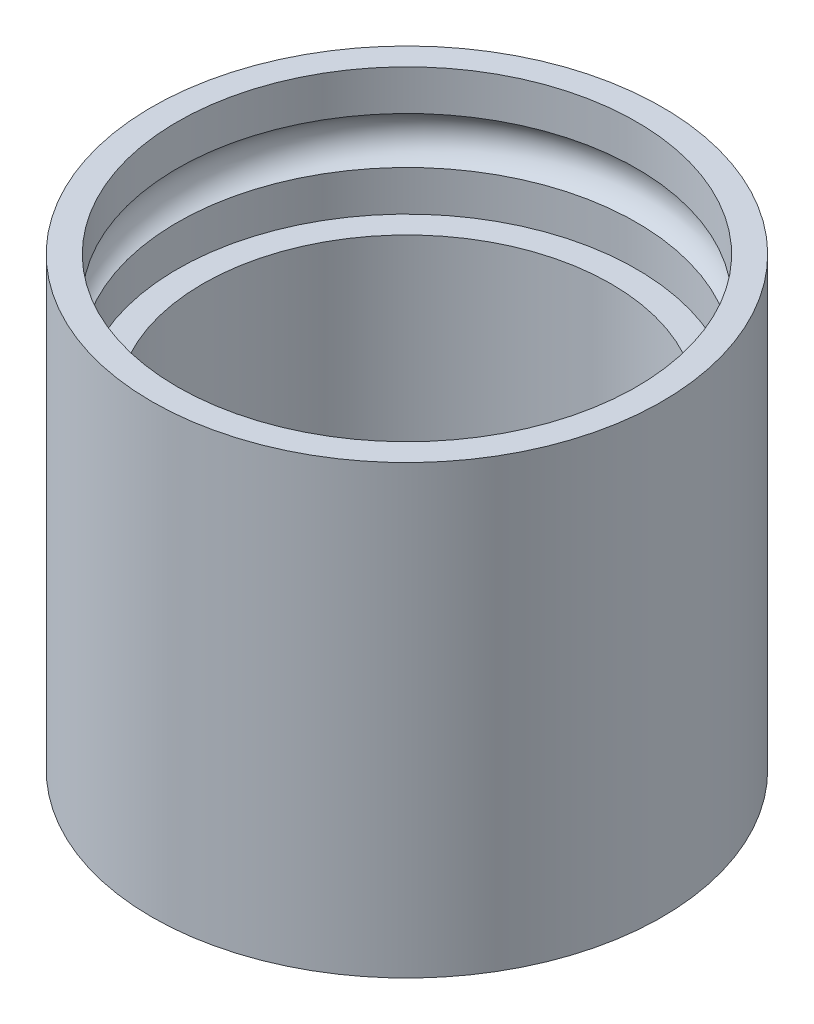
ISO-10303-21;
HEADER;
FILE_DESCRIPTION(('STEP AP214'),'2;1');
FILE_NAME('part.step','',(''),(''),'','','');
FILE_SCHEMA(('AUTOMOTIVE_DESIGN { 1 0 10303 214 1 1 1 1 }'));
ENDSEC;
DATA;
#1=APPLICATION_CONTEXT('core data for automotive mechanical design processes');
#2=APPLICATION_PROTOCOL_DEFINITION('international standard','automotive_design',2000,#1);
#3=PRODUCT_CONTEXT('',#1,'mechanical');
#4=PRODUCT('Part','Part','',(#3));
#5=PRODUCT_RELATED_PRODUCT_CATEGORY('part','',(#4));
#6=PRODUCT_DEFINITION_FORMATION('','',#4);
#7=PRODUCT_DEFINITION_CONTEXT('part definition',#1,'design');
#8=PRODUCT_DEFINITION('design','',#6,#7);
#9=PRODUCT_DEFINITION_SHAPE('','',#8);
#10=(LENGTH_UNIT() NAMED_UNIT(*) SI_UNIT(.MILLI.,.METRE.));
#11=(NAMED_UNIT(*) PLANE_ANGLE_UNIT() SI_UNIT($,.RADIAN.));
#12=(NAMED_UNIT(*) SI_UNIT($,.STERADIAN.) SOLID_ANGLE_UNIT());
#13=UNCERTAINTY_MEASURE_WITH_UNIT(LENGTH_MEASURE(1.E-05),#10,'distance_accuracy_value','');
#14=(GEOMETRIC_REPRESENTATION_CONTEXT(3) GLOBAL_UNCERTAINTY_ASSIGNED_CONTEXT((#13)) GLOBAL_UNIT_ASSIGNED_CONTEXT((#10,
#11,#12)) REPRESENTATION_CONTEXT('',''));
#15=CARTESIAN_POINT('',(0.,0.,0.));
#16=DIRECTION('',(0.,0.,1.));
#17=DIRECTION('',(1.,0.,0.));
#18=AXIS2_PLACEMENT_3D('',#15,#16,#17);
#19=CARTESIAN_POINT('',(0.,0.,-5.08));
#20=DIRECTION('',(0.,1.,0.));
#21=DIRECTION('',(0.,0.,1.));
#22=AXIS2_PLACEMENT_3D('',#19,#20,#21);
#23=PLANE('',#22);
#24=CARTESIAN_POINT('',(0.,0.,-50.8));
#25=DIRECTION('',(0.,1.,0.));
#26=DIRECTION('',(0.,0.,1.));
#27=AXIS2_PLACEMENT_3D('',#24,#25,#26);
#28=CIRCLE('',#27,50.8);
#29=CARTESIAN_POINT('',(0.,0.,0.));
#30=VERTEX_POINT('',#29);
#31=EDGE_CURVE('E79',#30,#30,#28,.T.);
#32=ORIENTED_EDGE('',*,*,#31,.T.);
#33=EDGE_LOOP('',(#32));
#34=FACE_BOUND('',#33,.T.);
#35=CARTESIAN_POINT('',(0.,0.,-50.8));
#36=DIRECTION('',(0.,1.,0.));
#37=DIRECTION('',(0.,0.,1.));
#38=AXIS2_PLACEMENT_3D('',#35,#36,#37);
#39=CIRCLE('',#38,45.72);
#40=CARTESIAN_POINT('',(0.,0.,-5.08));
#41=VERTEX_POINT('',#40);
#42=EDGE_CURVE('E10',#41,#41,#39,.T.);
#43=ORIENTED_EDGE('',*,*,#42,.F.);
#44=EDGE_LOOP('',(#43));
#45=FACE_BOUND('',#44,.T.);
#46=ADVANCED_FACE('F35',(#34,#45),#23,.T.);
#47=CARTESIAN_POINT('',(0.,-28.313229253638,-50.8));
#48=DIRECTION('',(0.,1.,0.));
#49=DIRECTION('',(0.,0.,1.));
#50=AXIS2_PLACEMENT_3D('',#47,#48,#49);
#51=CYLINDRICAL_SURFACE('',#50,45.72);
#52=ORIENTED_EDGE('',*,*,#42,.T.);
#53=EDGE_LOOP('',(#52));
#54=FACE_BOUND('',#53,.T.);
#55=CARTESIAN_POINT('',(0.,-8.04410309392484,-50.8));
#56=DIRECTION('',(0.,1.,0.));
#57=DIRECTION('',(0.,0.,1.));
#58=AXIS2_PLACEMENT_3D('',#55,#56,#57);
#59=CIRCLE('',#58,45.72);
#60=CARTESIAN_POINT('',(0.,-8.04410309392486,-5.08));
#61=VERTEX_POINT('',#60);
#62=EDGE_CURVE('E42',#61,#61,#59,.T.);
#63=ORIENTED_EDGE('',*,*,#62,.F.);
#64=EDGE_LOOP('',(#63));
#65=FACE_BOUND('',#64,.T.);
#66=ADVANCED_FACE('F97',(#54,#65),#51,.F.);
#67=CARTESIAN_POINT('',(0.,-12.7,-50.8));
#68=DIRECTION('',(0.,1.,0.));
#69=DIRECTION('',(0.,0.,1.));
#70=AXIS2_PLACEMENT_3D('',#67,#68,#69);
#71=TOROIDAL_SURFACE('',#70,43.688,5.08);
#72=ORIENTED_EDGE('',*,*,#62,.T.);
#73=EDGE_LOOP('',(#72));
#74=FACE_BOUND('',#73,.T.);
#75=CARTESIAN_POINT('',(0.,-17.3558969060751,-50.8));
#76=DIRECTION('',(0.,1.,0.));
#77=DIRECTION('',(0.,0.,1.));
#78=AXIS2_PLACEMENT_3D('',#75,#76,#77);
#79=CIRCLE('',#78,45.72);
#80=CARTESIAN_POINT('',(0.,-17.3558969060751,-5.08));
#81=VERTEX_POINT('',#80);
#82=EDGE_CURVE('E49',#81,#81,#79,.T.);
#83=ORIENTED_EDGE('',*,*,#82,.F.);
#84=EDGE_LOOP('',(#83));
#85=FACE_BOUND('',#84,.T.);
#86=ADVANCED_FACE('F101',(#74,#85),#71,.F.);
#87=CARTESIAN_POINT('',(0.,-28.313229253638,-50.8));
#88=DIRECTION('',(0.,1.,0.));
#89=DIRECTION('',(0.,0.,1.));
#90=AXIS2_PLACEMENT_3D('',#87,#88,#89);
#91=CYLINDRICAL_SURFACE('',#90,45.72);
#92=ORIENTED_EDGE('',*,*,#82,.T.);
#93=EDGE_LOOP('',(#92));
#94=FACE_BOUND('',#93,.T.);
#95=CARTESIAN_POINT('',(0.,-25.4,-50.8));
#96=DIRECTION('',(0.,1.,0.));
#97=DIRECTION('',(0.,0.,1.));
#98=AXIS2_PLACEMENT_3D('',#95,#96,#97);
#99=CIRCLE('',#98,45.72);
#100=CARTESIAN_POINT('',(0.,-25.4,-5.08));
#101=VERTEX_POINT('',#100);
#102=EDGE_CURVE('E54',#101,#101,#99,.T.);
#103=ORIENTED_EDGE('',*,*,#102,.F.);
#104=EDGE_LOOP('',(#103));
#105=FACE_BOUND('',#104,.T.);
#106=ADVANCED_FACE('F105',(#94,#105),#91,.F.);
#107=CARTESIAN_POINT('',(0.,-25.4,-10.16));
#108=DIRECTION('',(0.,1.,0.));
#109=DIRECTION('',(0.,0.,1.));
#110=AXIS2_PLACEMENT_3D('',#107,#108,#109);
#111=PLANE('',#110);
#112=ORIENTED_EDGE('',*,*,#102,.T.);
#113=EDGE_LOOP('',(#112));
#114=FACE_BOUND('',#113,.T.);
#115=CARTESIAN_POINT('',(0.,-25.4,-50.8));
#116=DIRECTION('',(0.,1.,0.));
#117=DIRECTION('',(0.,0.,1.));
#118=AXIS2_PLACEMENT_3D('',#115,#116,#117);
#119=CIRCLE('',#118,40.64);
#120=CARTESIAN_POINT('',(0.,-25.4,-10.16));
#121=VERTEX_POINT('',#120);
#122=EDGE_CURVE('E60',#121,#121,#119,.T.);
#123=ORIENTED_EDGE('',*,*,#122,.F.);
#124=EDGE_LOOP('',(#123));
#125=FACE_BOUND('',#124,.T.);
#126=ADVANCED_FACE('F111',(#114,#125),#111,.T.);
#127=CARTESIAN_POINT('',(0.,-28.313229253638,-50.8));
#128=DIRECTION('',(0.,1.,0.));
#129=DIRECTION('',(0.,0.,1.));
#130=AXIS2_PLACEMENT_3D('',#127,#128,#129);
#131=CYLINDRICAL_SURFACE('',#130,40.64);
#132=ORIENTED_EDGE('',*,*,#122,.T.);
#133=EDGE_LOOP('',(#132));
#134=FACE_BOUND('',#133,.T.);
#135=CARTESIAN_POINT('',(0.,-76.2,-50.8));
#136=DIRECTION('',(0.,1.,0.));
#137=DIRECTION('',(0.,0.,1.));
#138=AXIS2_PLACEMENT_3D('',#135,#136,#137);
#139=CIRCLE('',#138,40.64);
#140=CARTESIAN_POINT('',(0.,-76.2,-10.16));
#141=VERTEX_POINT('',#140);
#142=EDGE_CURVE('E64',#141,#141,#139,.T.);
#143=ORIENTED_EDGE('',*,*,#142,.F.);
#144=EDGE_LOOP('',(#143));
#145=FACE_BOUND('',#144,.T.);
#146=ADVANCED_FACE('F115',(#134,#145),#131,.F.);
#147=CARTESIAN_POINT('',(0.,-76.2,-10.16));
#148=DIRECTION('',(0.,1.,0.));
#149=DIRECTION('',(0.,0.,1.));
#150=AXIS2_PLACEMENT_3D('',#147,#148,#149);
#151=PLANE('',#150);
#152=ORIENTED_EDGE('',*,*,#142,.T.);
#153=EDGE_LOOP('',(#152));
#154=FACE_BOUND('',#153,.T.);
#155=CARTESIAN_POINT('',(0.,-76.2,-50.8));
#156=DIRECTION('',(0.,1.,0.));
#157=DIRECTION('',(0.,0.,1.));
#158=AXIS2_PLACEMENT_3D('',#155,#156,#157);
#159=CIRCLE('',#158,33.02);
#160=CARTESIAN_POINT('',(0.,-76.2,-17.78));
#161=VERTEX_POINT('',#160);
#162=EDGE_CURVE('E68',#161,#161,#159,.T.);
#163=ORIENTED_EDGE('',*,*,#162,.F.);
#164=EDGE_LOOP('',(#163));
#165=FACE_BOUND('',#164,.T.);
#166=ADVANCED_FACE('F119',(#154,#165),#151,.T.);
#167=CARTESIAN_POINT('',(0.,-28.313229253638,-50.8));
#168=DIRECTION('',(0.,1.,0.));
#169=DIRECTION('',(0.,0.,1.));
#170=AXIS2_PLACEMENT_3D('',#167,#168,#169);
#171=CYLINDRICAL_SURFACE('',#170,33.02);
#172=ORIENTED_EDGE('',*,*,#162,.T.);
#173=EDGE_LOOP('',(#172));
#174=FACE_BOUND('',#173,.T.);
#175=CARTESIAN_POINT('',(0.,-88.9,-50.8));
#176=DIRECTION('',(0.,1.,0.));
#177=DIRECTION('',(0.,0.,1.));
#178=AXIS2_PLACEMENT_3D('',#175,#176,#177);
#179=CIRCLE('',#178,33.02);
#180=CARTESIAN_POINT('',(0.,-88.9,-17.78));
#181=VERTEX_POINT('',#180);
#182=EDGE_CURVE('E72',#181,#181,#179,.T.);
#183=ORIENTED_EDGE('',*,*,#182,.F.);
#184=EDGE_LOOP('',(#183));
#185=FACE_BOUND('',#184,.T.);
#186=ADVANCED_FACE('F93',(#174,#185),#171,.F.);
#187=CARTESIAN_POINT('',(0.,-88.9,0.));
#188=DIRECTION('',(0.,-1.,0.));
#189=DIRECTION('',(0.,0.,-1.));
#190=AXIS2_PLACEMENT_3D('',#187,#188,#189);
#191=PLANE('',#190);
#192=ORIENTED_EDGE('',*,*,#182,.T.);
#193=EDGE_LOOP('',(#192));
#194=FACE_BOUND('',#193,.T.);
#195=CARTESIAN_POINT('',(0.,-88.9,-50.8));
#196=DIRECTION('',(0.,1.,0.));
#197=DIRECTION('',(0.,0.,1.));
#198=AXIS2_PLACEMENT_3D('',#195,#196,#197);
#199=CIRCLE('',#198,50.8);
#200=CARTESIAN_POINT('',(0.,-88.9,0.));
#201=VERTEX_POINT('',#200);
#202=EDGE_CURVE('E76',#201,#201,#199,.T.);
#203=ORIENTED_EDGE('',*,*,#202,.F.);
#204=EDGE_LOOP('',(#203));
#205=FACE_BOUND('',#204,.T.);
#206=ADVANCED_FACE('F87',(#194,#205),#191,.T.);
#207=CARTESIAN_POINT('',(0.,-28.313229253638,-50.8));
#208=DIRECTION('',(0.,1.,0.));
#209=DIRECTION('',(0.,0.,1.));
#210=AXIS2_PLACEMENT_3D('',#207,#208,#209);
#211=CYLINDRICAL_SURFACE('',#210,50.8);
#212=ORIENTED_EDGE('',*,*,#202,.T.);
#213=EDGE_LOOP('',(#212));
#214=FACE_BOUND('',#213,.T.);
#215=ORIENTED_EDGE('',*,*,#31,.F.);
#216=EDGE_LOOP('',(#215));
#217=FACE_BOUND('',#216,.T.);
#218=ADVANCED_FACE('F85',(#214,#217),#211,.T.);
#219=CLOSED_SHELL('',(#46,#66,#86,#106,#126,#146,#166,#186,#206,#218));
#220=MANIFOLD_SOLID_BREP('B2',#219);
#221=ADVANCED_BREP_SHAPE_REPRESENTATION('',(#18,#220),#14);
#222=SHAPE_DEFINITION_REPRESENTATION(#9,#221);
ENDSEC;
END-ISO-10303-21;
